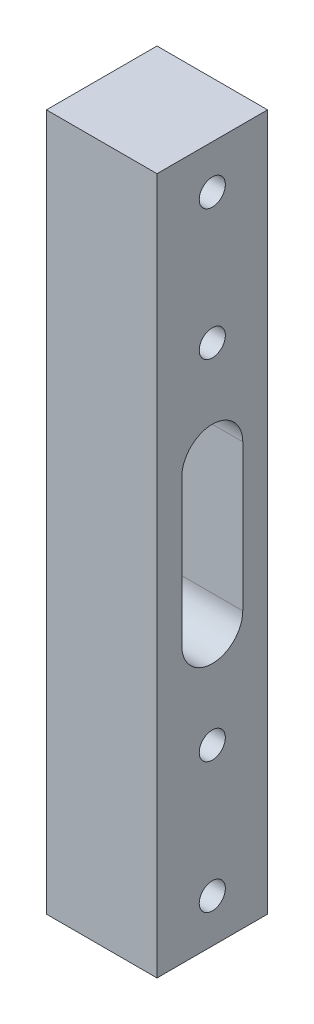
ISO-10303-21;
HEADER;
FILE_DESCRIPTION(('STEP AP214'),'2;1');
FILE_NAME('part.step','',(''),(''),'','','');
FILE_SCHEMA(('AUTOMOTIVE_DESIGN { 1 0 10303 214 1 1 1 1 }'));
ENDSEC;
DATA;
#1=APPLICATION_CONTEXT('core data for automotive mechanical design processes');
#2=APPLICATION_PROTOCOL_DEFINITION('international standard','automotive_design',2000,#1);
#3=PRODUCT_CONTEXT('',#1,'mechanical');
#4=PRODUCT('Part','Part','',(#3));
#5=PRODUCT_RELATED_PRODUCT_CATEGORY('part','',(#4));
#6=PRODUCT_DEFINITION_FORMATION('','',#4);
#7=PRODUCT_DEFINITION_CONTEXT('part definition',#1,'design');
#8=PRODUCT_DEFINITION('design','',#6,#7);
#9=PRODUCT_DEFINITION_SHAPE('','',#8);
#10=(LENGTH_UNIT() NAMED_UNIT(*) SI_UNIT(.MILLI.,.METRE.));
#11=(NAMED_UNIT(*) PLANE_ANGLE_UNIT() SI_UNIT($,.RADIAN.));
#12=(NAMED_UNIT(*) SI_UNIT($,.STERADIAN.) SOLID_ANGLE_UNIT());
#13=UNCERTAINTY_MEASURE_WITH_UNIT(LENGTH_MEASURE(1.E-05),#10,'distance_accuracy_value','');
#14=(GEOMETRIC_REPRESENTATION_CONTEXT(3) GLOBAL_UNCERTAINTY_ASSIGNED_CONTEXT((#13)) GLOBAL_UNIT_ASSIGNED_CONTEXT((#10,
#11,#12)) REPRESENTATION_CONTEXT('',''));
#15=CARTESIAN_POINT('',(0.,0.,0.));
#16=DIRECTION('',(0.,0.,1.));
#17=DIRECTION('',(1.,0.,0.));
#18=AXIS2_PLACEMENT_3D('',#15,#16,#17);
#19=CARTESIAN_POINT('',(585.652355873234,0.,0.));
#20=DIRECTION('',(1.,0.,0.));
#21=DIRECTION('',(0.,0.,-1.));
#22=AXIS2_PLACEMENT_3D('',#19,#20,#21);
#23=PLANE('',#22);
#24=CARTESIAN_POINT('',(585.652355873234,-218.103634399198,-285.051927040904));
#25=DIRECTION('',(1.,0.,0.));
#26=DIRECTION('',(0.,1.,0.));
#27=AXIS2_PLACEMENT_3D('',#24,#25,#26);
#28=CIRCLE('',#27,1.50000000000002);
#29=CARTESIAN_POINT('',(585.652355873234,-216.603634399198,-285.051927040904));
#30=VERTEX_POINT('',#29);
#31=EDGE_CURVE('E146',#30,#30,#28,.T.);
#32=ORIENTED_EDGE('',*,*,#31,.F.);
#33=EDGE_LOOP('',(#32));
#34=FACE_BOUND('',#33,.T.);
#35=CARTESIAN_POINT('',(585.652355873234,-273.103634399198,-285.051927040904));
#36=DIRECTION('',(1.,0.,0.));
#37=DIRECTION('',(0.,1.,0.));
#38=AXIS2_PLACEMENT_3D('',#35,#36,#37);
#39=CIRCLE('',#38,1.50000000000002);
#40=CARTESIAN_POINT('',(585.652355873234,-271.603634399198,-285.051927040904));
#41=VERTEX_POINT('',#40);
#42=EDGE_CURVE('E158',#41,#41,#39,.T.);
#43=ORIENTED_EDGE('',*,*,#42,.F.);
#44=EDGE_LOOP('',(#43));
#45=FACE_BOUND('',#44,.T.);
#46=DIRECTION('',(0.,1.,0.));
#47=VECTOR('',#46,1.);
#48=CARTESIAN_POINT('',(585.652355873234,-293.103634399198,-291.401927040904));
#49=LINE('',#48,#47);
#50=CARTESIAN_POINT('',(585.652355873234,-293.103634399198,-291.401927040904));
#51=VERTEX_POINT('',#50);
#52=CARTESIAN_POINT('',(585.652355873234,-213.103634399198,-291.401927040904));
#53=VERTEX_POINT('',#52);
#54=EDGE_CURVE('E164',#51,#53,#49,.T.);
#55=ORIENTED_EDGE('',*,*,#54,.T.);
#56=DIRECTION('',(0.,0.,1.));
#57=VECTOR('',#56,1.);
#58=CARTESIAN_POINT('',(585.652355873234,-213.103634399198,-291.401927040904));
#59=LINE('',#58,#57);
#60=CARTESIAN_POINT('',(585.652355873234,-213.103634399198,-278.701927040904));
#61=VERTEX_POINT('',#60);
#62=EDGE_CURVE('E167',#53,#61,#59,.T.);
#63=ORIENTED_EDGE('',*,*,#62,.T.);
#64=DIRECTION('',(0.,-1.,0.));
#65=VECTOR('',#64,1.);
#66=CARTESIAN_POINT('',(585.652355873234,-293.103634399198,-278.701927040904));
#67=LINE('',#66,#65);
#68=CARTESIAN_POINT('',(585.652355873234,-293.103634399198,-278.701927040904));
#69=VERTEX_POINT('',#68);
#70=EDGE_CURVE('E170',#61,#69,#67,.T.);
#71=ORIENTED_EDGE('',*,*,#70,.T.);
#72=DIRECTION('',(0.,0.,-1.));
#73=VECTOR('',#72,1.);
#74=CARTESIAN_POINT('',(585.652355873234,-293.103634399198,-291.401927040904));
#75=LINE('',#74,#73);
#76=EDGE_CURVE('E172',#69,#51,#75,.T.);
#77=ORIENTED_EDGE('',*,*,#76,.T.);
#78=EDGE_LOOP('',(#55,#63,#71,#77));
#79=FACE_BOUND('',#78,.T.);
#80=CARTESIAN_POINT('',(585.652355873234,-288.103634399198,-285.051927040904));
#81=DIRECTION('',(1.,0.,0.));
#82=DIRECTION('',(0.,1.,0.));
#83=AXIS2_PLACEMENT_3D('',#80,#81,#82);
#84=CIRCLE('',#83,1.49999999999997);
#85=CARTESIAN_POINT('',(585.652355873234,-286.603634399198,-285.051927040904));
#86=VERTEX_POINT('',#85);
#87=EDGE_CURVE('E152',#86,#86,#84,.T.);
#88=ORIENTED_EDGE('',*,*,#87,.F.);
#89=EDGE_LOOP('',(#88));
#90=FACE_BOUND('',#89,.T.);
#91=CARTESIAN_POINT('',(585.652355873234,-233.103634399198,-285.051927040904));
#92=DIRECTION('',(1.,0.,0.));
#93=DIRECTION('',(0.,1.,0.));
#94=AXIS2_PLACEMENT_3D('',#91,#92,#93);
#95=CIRCLE('',#94,1.50000000000002);
#96=CARTESIAN_POINT('',(585.652355873234,-231.603634399198,-285.051927040904));
#97=VERTEX_POINT('',#96);
#98=EDGE_CURVE('E140',#97,#97,#95,.T.);
#99=ORIENTED_EDGE('',*,*,#98,.F.);
#100=EDGE_LOOP('',(#99));
#101=FACE_BOUND('',#100,.T.);
#102=DIRECTION('',(0.,1.,0.));
#103=VECTOR('',#102,1.);
#104=CARTESIAN_POINT('',(585.652355873234,-261.508906717245,-288.551927040904));
#105=LINE('',#104,#103);
#106=CARTESIAN_POINT('',(585.652355873234,-261.508906717245,-288.551927040904));
#107=VERTEX_POINT('',#106);
#108=CARTESIAN_POINT('',(585.652355873234,-244.698362081151,-288.551927040904));
#109=VERTEX_POINT('',#108);
#110=EDGE_CURVE('E112',#107,#109,#105,.T.);
#111=ORIENTED_EDGE('',*,*,#110,.F.);
#112=CARTESIAN_POINT('',(585.652355873234,-261.508906717245,-285.051927040904));
#113=DIRECTION('',(1.,0.,0.));
#114=DIRECTION('',(0.,1.,0.));
#115=AXIS2_PLACEMENT_3D('',#112,#113,#114);
#116=CIRCLE('',#115,3.5);
#117=CARTESIAN_POINT('',(585.652355873234,-261.508906717245,-281.551927040904));
#118=VERTEX_POINT('',#117);
#119=EDGE_CURVE('E104',#118,#107,#116,.T.);
#120=ORIENTED_EDGE('',*,*,#119,.F.);
#121=DIRECTION('',(0.,-1.,0.));
#122=VECTOR('',#121,1.);
#123=CARTESIAN_POINT('',(585.652355873234,-261.508906717245,-281.551927040904));
#124=LINE('',#123,#122);
#125=CARTESIAN_POINT('',(585.652355873234,-244.698362081151,-281.551927040904));
#126=VERTEX_POINT('',#125);
#127=EDGE_CURVE('E126',#126,#118,#124,.T.);
#128=ORIENTED_EDGE('',*,*,#127,.F.);
#129=CARTESIAN_POINT('',(585.652355873234,-244.698362081151,-285.051927040904));
#130=DIRECTION('',(1.,0.,0.));
#131=DIRECTION('',(0.,1.,0.));
#132=AXIS2_PLACEMENT_3D('',#129,#130,#131);
#133=CIRCLE('',#132,3.5);
#134=EDGE_CURVE('E124',#109,#126,#133,.T.);
#135=ORIENTED_EDGE('',*,*,#134,.F.);
#136=EDGE_LOOP('',(#111,#120,#128,#135));
#137=FACE_BOUND('',#136,.T.);
#138=ADVANCED_FACE('F39',(#34,#45,#79,#90,#101,#137),#23,.T.);
#139=CARTESIAN_POINT('',(572.952355873234,0.,0.));
#140=DIRECTION('',(1.,0.,0.));
#141=DIRECTION('',(0.,0.,-1.));
#142=AXIS2_PLACEMENT_3D('',#139,#140,#141);
#143=PLANE('',#142);
#144=CARTESIAN_POINT('',(572.952355873234,-233.103634399198,-285.051927040904));
#145=DIRECTION('',(1.,0.,0.));
#146=DIRECTION('',(0.,1.,0.));
#147=AXIS2_PLACEMENT_3D('',#144,#145,#146);
#148=CIRCLE('',#147,1.50000000000002);
#149=CARTESIAN_POINT('',(572.952355873234,-231.603634399198,-285.051927040904));
#150=VERTEX_POINT('',#149);
#151=EDGE_CURVE('E120',#150,#150,#148,.T.);
#152=ORIENTED_EDGE('',*,*,#151,.T.);
#153=EDGE_LOOP('',(#152));
#154=FACE_BOUND('',#153,.T.);
#155=CARTESIAN_POINT('',(572.952355873234,-218.103634399198,-285.051927040904));
#156=DIRECTION('',(1.,0.,0.));
#157=DIRECTION('',(0.,1.,0.));
#158=AXIS2_PLACEMENT_3D('',#155,#156,#157);
#159=CIRCLE('',#158,1.50000000000002);
#160=CARTESIAN_POINT('',(572.952355873234,-216.603634399198,-285.051927040904));
#161=VERTEX_POINT('',#160);
#162=EDGE_CURVE('E143',#161,#161,#159,.T.);
#163=ORIENTED_EDGE('',*,*,#162,.T.);
#164=EDGE_LOOP('',(#163));
#165=FACE_BOUND('',#164,.T.);
#166=CARTESIAN_POINT('',(572.952355873234,-288.103634399198,-285.051927040904));
#167=DIRECTION('',(1.,0.,0.));
#168=DIRECTION('',(0.,1.,0.));
#169=AXIS2_PLACEMENT_3D('',#166,#167,#168);
#170=CIRCLE('',#169,1.49999999999997);
#171=CARTESIAN_POINT('',(572.952355873234,-286.603634399198,-285.051927040904));
#172=VERTEX_POINT('',#171);
#173=EDGE_CURVE('E149',#172,#172,#170,.T.);
#174=ORIENTED_EDGE('',*,*,#173,.T.);
#175=EDGE_LOOP('',(#174));
#176=FACE_BOUND('',#175,.T.);
#177=CARTESIAN_POINT('',(572.952355873234,-273.103634399198,-285.051927040904));
#178=DIRECTION('',(1.,0.,0.));
#179=DIRECTION('',(0.,1.,0.));
#180=AXIS2_PLACEMENT_3D('',#177,#178,#179);
#181=CIRCLE('',#180,1.50000000000002);
#182=CARTESIAN_POINT('',(572.952355873234,-271.603634399198,-285.051927040904));
#183=VERTEX_POINT('',#182);
#184=EDGE_CURVE('E155',#183,#183,#181,.T.);
#185=ORIENTED_EDGE('',*,*,#184,.T.);
#186=EDGE_LOOP('',(#185));
#187=FACE_BOUND('',#186,.T.);
#188=DIRECTION('',(0.,1.,0.));
#189=VECTOR('',#188,1.);
#190=CARTESIAN_POINT('',(572.952355873234,-293.103634399198,-291.401927040904));
#191=LINE('',#190,#189);
#192=CARTESIAN_POINT('',(572.952355873234,-293.103634399198,-291.401927040904));
#193=VERTEX_POINT('',#192);
#194=CARTESIAN_POINT('',(572.952355873234,-213.103634399198,-291.401927040904));
#195=VERTEX_POINT('',#194);
#196=EDGE_CURVE('E161',#193,#195,#191,.T.);
#197=ORIENTED_EDGE('',*,*,#196,.F.);
#198=DIRECTION('',(0.,0.,-1.));
#199=VECTOR('',#198,1.);
#200=CARTESIAN_POINT('',(572.952355873234,-293.103634399198,-291.401927040904));
#201=LINE('',#200,#199);
#202=CARTESIAN_POINT('',(572.952355873234,-293.103634399198,-278.701927040904));
#203=VERTEX_POINT('',#202);
#204=EDGE_CURVE('E168',#203,#193,#201,.T.);
#205=ORIENTED_EDGE('',*,*,#204,.F.);
#206=DIRECTION('',(0.,-1.,0.));
#207=VECTOR('',#206,1.);
#208=CARTESIAN_POINT('',(572.952355873234,-293.103634399198,-278.701927040904));
#209=LINE('',#208,#207);
#210=CARTESIAN_POINT('',(572.952355873234,-213.103634399198,-278.701927040904));
#211=VERTEX_POINT('',#210);
#212=EDGE_CURVE('E179',#211,#203,#209,.T.);
#213=ORIENTED_EDGE('',*,*,#212,.F.);
#214=DIRECTION('',(0.,0.,1.));
#215=VECTOR('',#214,1.);
#216=CARTESIAN_POINT('',(572.952355873234,-213.103634399198,-291.401927040904));
#217=LINE('',#216,#215);
#218=EDGE_CURVE('E177',#195,#211,#217,.T.);
#219=ORIENTED_EDGE('',*,*,#218,.F.);
#220=EDGE_LOOP('',(#197,#205,#213,#219));
#221=FACE_BOUND('',#220,.T.);
#222=CARTESIAN_POINT('',(572.952355873234,-261.508906717245,-285.051927040904));
#223=DIRECTION('',(1.,0.,0.));
#224=DIRECTION('',(0.,1.,0.));
#225=AXIS2_PLACEMENT_3D('',#222,#223,#224);
#226=CIRCLE('',#225,3.5);
#227=CARTESIAN_POINT('',(572.952355873234,-261.508906717245,-281.551927040904));
#228=VERTEX_POINT('',#227);
#229=CARTESIAN_POINT('',(572.952355873234,-261.508906717245,-288.551927040904));
#230=VERTEX_POINT('',#229);
#231=EDGE_CURVE('E62',#228,#230,#226,.T.);
#232=ORIENTED_EDGE('',*,*,#231,.T.);
#233=DIRECTION('',(0.,1.,0.));
#234=VECTOR('',#233,1.);
#235=CARTESIAN_POINT('',(572.952355873234,-261.508906717245,-288.551927040904));
#236=LINE('',#235,#234);
#237=CARTESIAN_POINT('',(572.952355873234,-244.698362081151,-288.551927040904));
#238=VERTEX_POINT('',#237);
#239=EDGE_CURVE('E119',#230,#238,#236,.T.);
#240=ORIENTED_EDGE('',*,*,#239,.T.);
#241=CARTESIAN_POINT('',(572.952355873234,-244.698362081151,-285.051927040904));
#242=DIRECTION('',(1.,0.,0.));
#243=DIRECTION('',(0.,1.,0.));
#244=AXIS2_PLACEMENT_3D('',#241,#242,#243);
#245=CIRCLE('',#244,3.5);
#246=CARTESIAN_POINT('',(572.952355873234,-244.698362081151,-281.551927040904));
#247=VERTEX_POINT('',#246);
#248=EDGE_CURVE('E132',#238,#247,#245,.T.);
#249=ORIENTED_EDGE('',*,*,#248,.T.);
#250=DIRECTION('',(0.,-1.,0.));
#251=VECTOR('',#250,1.);
#252=CARTESIAN_POINT('',(572.952355873234,-261.508906717245,-281.551927040904));
#253=LINE('',#252,#251);
#254=EDGE_CURVE('E113',#247,#228,#253,.T.);
#255=ORIENTED_EDGE('',*,*,#254,.T.);
#256=EDGE_LOOP('',(#232,#240,#249,#255));
#257=FACE_BOUND('',#256,.T.);
#258=ADVANCED_FACE('F197',(#154,#165,#176,#187,#221,#257),#143,.F.);
#259=CARTESIAN_POINT('',(585.652355873234,-293.103634399198,-291.401927040904));
#260=DIRECTION('',(0.,0.,1.));
#261=DIRECTION('',(1.,0.,0.));
#262=AXIS2_PLACEMENT_3D('',#259,#260,#261);
#263=PLANE('',#262);
#264=ORIENTED_EDGE('',*,*,#196,.T.);
#265=DIRECTION('',(-1.,0.,0.));
#266=VECTOR('',#265,1.);
#267=CARTESIAN_POINT('',(585.652355873234,-213.103634399198,-291.401927040904));
#268=LINE('',#267,#266);
#269=EDGE_CURVE('E11',#53,#195,#268,.T.);
#270=ORIENTED_EDGE('',*,*,#269,.F.);
#271=ORIENTED_EDGE('',*,*,#54,.F.);
#272=DIRECTION('',(-1.,0.,0.));
#273=VECTOR('',#272,1.);
#274=CARTESIAN_POINT('',(585.652355873234,-293.103634399198,-291.401927040904));
#275=LINE('',#274,#273);
#276=EDGE_CURVE('E174',#51,#193,#275,.T.);
#277=ORIENTED_EDGE('',*,*,#276,.T.);
#278=EDGE_LOOP('',(#264,#270,#271,#277));
#279=FACE_BOUND('',#278,.T.);
#280=ADVANCED_FACE('F41',(#279),#263,.F.);
#281=CARTESIAN_POINT('',(585.652355873234,-213.103634399198,-291.401927040904));
#282=DIRECTION('',(0.,-1.,0.));
#283=DIRECTION('',(1.,0.,0.));
#284=AXIS2_PLACEMENT_3D('',#281,#282,#283);
#285=PLANE('',#284);
#286=ORIENTED_EDGE('',*,*,#218,.T.);
#287=DIRECTION('',(-1.,0.,0.));
#288=VECTOR('',#287,1.);
#289=CARTESIAN_POINT('',(585.652355873234,-213.103634399198,-278.701927040904));
#290=LINE('',#289,#288);
#291=EDGE_CURVE('E47',#61,#211,#290,.T.);
#292=ORIENTED_EDGE('',*,*,#291,.F.);
#293=ORIENTED_EDGE('',*,*,#62,.F.);
#294=ORIENTED_EDGE('',*,*,#269,.T.);
#295=EDGE_LOOP('',(#286,#292,#293,#294));
#296=FACE_BOUND('',#295,.T.);
#297=ADVANCED_FACE('F208',(#296),#285,.F.);
#298=CARTESIAN_POINT('',(585.652355873234,-293.103634399198,-278.701927040904));
#299=DIRECTION('',(0.,0.,-1.));
#300=DIRECTION('',(0.,1.,0.));
#301=AXIS2_PLACEMENT_3D('',#298,#299,#300);
#302=PLANE('',#301);
#303=ORIENTED_EDGE('',*,*,#212,.T.);
#304=DIRECTION('',(-1.,0.,0.));
#305=VECTOR('',#304,1.);
#306=CARTESIAN_POINT('',(585.652355873234,-293.103634399198,-278.701927040904));
#307=LINE('',#306,#305);
#308=EDGE_CURVE('E184',#69,#203,#307,.T.);
#309=ORIENTED_EDGE('',*,*,#308,.F.);
#310=ORIENTED_EDGE('',*,*,#70,.F.);
#311=ORIENTED_EDGE('',*,*,#291,.T.);
#312=EDGE_LOOP('',(#303,#309,#310,#311));
#313=FACE_BOUND('',#312,.T.);
#314=ADVANCED_FACE('F191',(#313),#302,.F.);
#315=CARTESIAN_POINT('',(585.652355873234,-293.103634399198,-291.401927040904));
#316=DIRECTION('',(0.,1.,0.));
#317=DIRECTION('',(-1.,0.,0.));
#318=AXIS2_PLACEMENT_3D('',#315,#316,#317);
#319=PLANE('',#318);
#320=ORIENTED_EDGE('',*,*,#204,.T.);
#321=ORIENTED_EDGE('',*,*,#276,.F.);
#322=ORIENTED_EDGE('',*,*,#76,.F.);
#323=ORIENTED_EDGE('',*,*,#308,.T.);
#324=EDGE_LOOP('',(#320,#321,#322,#323));
#325=FACE_BOUND('',#324,.T.);
#326=ADVANCED_FACE('F201',(#325),#319,.F.);
#327=CARTESIAN_POINT('',(585.652355873234,-273.103634399198,-285.051927040904));
#328=DIRECTION('',(-1.,0.,0.));
#329=DIRECTION('',(0.,-1.,0.));
#330=AXIS2_PLACEMENT_3D('',#327,#328,#329);
#331=CYLINDRICAL_SURFACE('',#330,1.50000000000002);
#332=ORIENTED_EDGE('',*,*,#42,.T.);
#333=EDGE_LOOP('',(#332));
#334=FACE_BOUND('',#333,.T.);
#335=ORIENTED_EDGE('',*,*,#184,.F.);
#336=EDGE_LOOP('',(#335));
#337=FACE_BOUND('',#336,.T.);
#338=ADVANCED_FACE('F226',(#334,#337),#331,.F.);
#339=CARTESIAN_POINT('',(585.652355873234,-288.103634399198,-285.051927040904));
#340=DIRECTION('',(-1.,0.,0.));
#341=DIRECTION('',(0.,-1.,0.));
#342=AXIS2_PLACEMENT_3D('',#339,#340,#341);
#343=CYLINDRICAL_SURFACE('',#342,1.49999999999997);
#344=ORIENTED_EDGE('',*,*,#87,.T.);
#345=EDGE_LOOP('',(#344));
#346=FACE_BOUND('',#345,.T.);
#347=ORIENTED_EDGE('',*,*,#173,.F.);
#348=EDGE_LOOP('',(#347));
#349=FACE_BOUND('',#348,.T.);
#350=ADVANCED_FACE('F233',(#346,#349),#343,.F.);
#351=CARTESIAN_POINT('',(585.652355873234,-218.103634399198,-285.051927040904));
#352=DIRECTION('',(-1.,0.,0.));
#353=DIRECTION('',(0.,-1.,0.));
#354=AXIS2_PLACEMENT_3D('',#351,#352,#353);
#355=CYLINDRICAL_SURFACE('',#354,1.50000000000002);
#356=ORIENTED_EDGE('',*,*,#31,.T.);
#357=EDGE_LOOP('',(#356));
#358=FACE_BOUND('',#357,.T.);
#359=ORIENTED_EDGE('',*,*,#162,.F.);
#360=EDGE_LOOP('',(#359));
#361=FACE_BOUND('',#360,.T.);
#362=ADVANCED_FACE('F238',(#358,#361),#355,.F.);
#363=CARTESIAN_POINT('',(585.652355873234,-233.103634399198,-285.051927040904));
#364=DIRECTION('',(-1.,0.,0.));
#365=DIRECTION('',(0.,-1.,0.));
#366=AXIS2_PLACEMENT_3D('',#363,#364,#365);
#367=CYLINDRICAL_SURFACE('',#366,1.50000000000002);
#368=ORIENTED_EDGE('',*,*,#98,.T.);
#369=EDGE_LOOP('',(#368));
#370=FACE_BOUND('',#369,.T.);
#371=ORIENTED_EDGE('',*,*,#151,.F.);
#372=EDGE_LOOP('',(#371));
#373=FACE_BOUND('',#372,.T.);
#374=ADVANCED_FACE('F247',(#370,#373),#367,.F.);
#375=CARTESIAN_POINT('',(585.652355873234,-261.508906717245,-285.051927040904));
#376=DIRECTION('',(-1.,0.,0.));
#377=DIRECTION('',(0.,-1.,0.));
#378=AXIS2_PLACEMENT_3D('',#375,#376,#377);
#379=CYLINDRICAL_SURFACE('',#378,3.5);
#380=ORIENTED_EDGE('',*,*,#231,.F.);
#381=DIRECTION('',(-1.,0.,0.));
#382=VECTOR('',#381,1.);
#383=CARTESIAN_POINT('',(585.652355873234,-261.508906717245,-281.551927040904));
#384=LINE('',#383,#382);
#385=EDGE_CURVE('E108',#118,#228,#384,.T.);
#386=ORIENTED_EDGE('',*,*,#385,.F.);
#387=ORIENTED_EDGE('',*,*,#119,.T.);
#388=DIRECTION('',(-1.,0.,0.));
#389=VECTOR('',#388,1.);
#390=CARTESIAN_POINT('',(585.652355873234,-261.508906717245,-288.551927040904));
#391=LINE('',#390,#389);
#392=EDGE_CURVE('E107',#107,#230,#391,.T.);
#393=ORIENTED_EDGE('',*,*,#392,.T.);
#394=EDGE_LOOP('',(#380,#386,#387,#393));
#395=FACE_BOUND('',#394,.T.);
#396=ADVANCED_FACE('F106',(#395),#379,.F.);
#397=CARTESIAN_POINT('',(585.652355873234,-261.508906717245,-288.551927040904));
#398=DIRECTION('',(0.,0.,1.));
#399=DIRECTION('',(1.,0.,0.));
#400=AXIS2_PLACEMENT_3D('',#397,#398,#399);
#401=PLANE('',#400);
#402=ORIENTED_EDGE('',*,*,#239,.F.);
#403=ORIENTED_EDGE('',*,*,#392,.F.);
#404=ORIENTED_EDGE('',*,*,#110,.T.);
#405=DIRECTION('',(-1.,0.,0.));
#406=VECTOR('',#405,1.);
#407=CARTESIAN_POINT('',(585.652355873234,-244.698362081151,-288.551927040904));
#408=LINE('',#407,#406);
#409=EDGE_CURVE('E121',#109,#238,#408,.T.);
#410=ORIENTED_EDGE('',*,*,#409,.T.);
#411=EDGE_LOOP('',(#402,#403,#404,#410));
#412=FACE_BOUND('',#411,.T.);
#413=ADVANCED_FACE('F116',(#412),#401,.T.);
#414=CARTESIAN_POINT('',(585.652355873234,-244.698362081151,-285.051927040904));
#415=DIRECTION('',(-1.,0.,0.));
#416=DIRECTION('',(0.,-1.,0.));
#417=AXIS2_PLACEMENT_3D('',#414,#415,#416);
#418=CYLINDRICAL_SURFACE('',#417,3.5);
#419=ORIENTED_EDGE('',*,*,#248,.F.);
#420=ORIENTED_EDGE('',*,*,#409,.F.);
#421=ORIENTED_EDGE('',*,*,#134,.T.);
#422=DIRECTION('',(-1.,0.,0.));
#423=VECTOR('',#422,1.);
#424=CARTESIAN_POINT('',(585.652355873234,-244.698362081151,-281.551927040904));
#425=LINE('',#424,#423);
#426=EDGE_CURVE('E54',#126,#247,#425,.T.);
#427=ORIENTED_EDGE('',*,*,#426,.T.);
#428=EDGE_LOOP('',(#419,#420,#421,#427));
#429=FACE_BOUND('',#428,.T.);
#430=ADVANCED_FACE('F259',(#429),#418,.F.);
#431=CARTESIAN_POINT('',(585.652355873234,-261.508906717245,-281.551927040904));
#432=DIRECTION('',(0.,0.,-1.));
#433=DIRECTION('',(-1.,0.,0.));
#434=AXIS2_PLACEMENT_3D('',#431,#432,#433);
#435=PLANE('',#434);
#436=ORIENTED_EDGE('',*,*,#254,.F.);
#437=ORIENTED_EDGE('',*,*,#426,.F.);
#438=ORIENTED_EDGE('',*,*,#127,.T.);
#439=ORIENTED_EDGE('',*,*,#385,.T.);
#440=EDGE_LOOP('',(#436,#437,#438,#439));
#441=FACE_BOUND('',#440,.T.);
#442=ADVANCED_FACE('F262',(#441),#435,.T.);
#443=CLOSED_SHELL('',(#138,#258,#280,#297,#314,#326,#338,#350,#362,#374,#396,#413,#430,#442));
#444=MANIFOLD_SOLID_BREP('B2',#443);
#445=ADVANCED_BREP_SHAPE_REPRESENTATION('',(#18,#444),#14);
#446=SHAPE_DEFINITION_REPRESENTATION(#9,#445);
ENDSEC;
END-ISO-10303-21;
